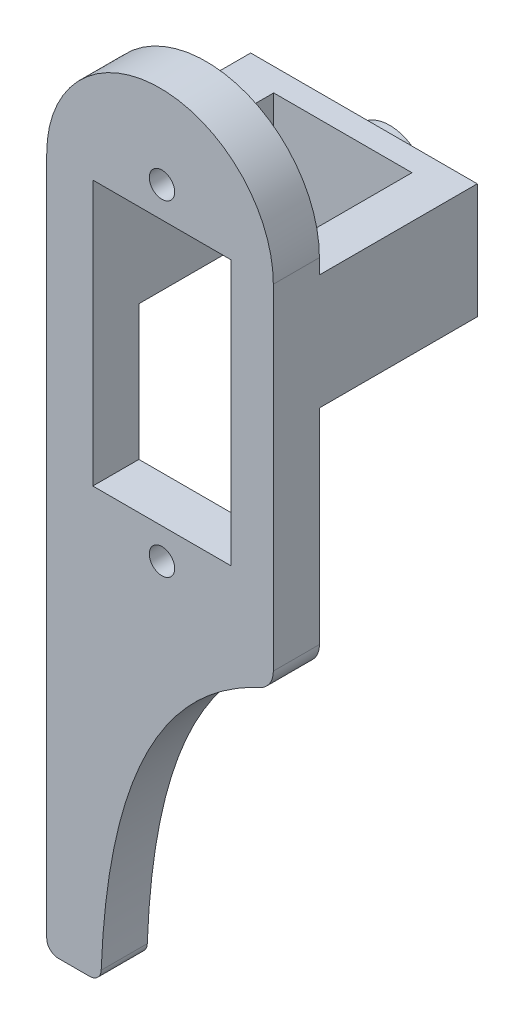
ISO-10303-21;
HEADER;
FILE_DESCRIPTION(('STEP AP214'),'2;1');
FILE_NAME('part.step','',(''),(''),'','','');
FILE_SCHEMA(('AUTOMOTIVE_DESIGN { 1 0 10303 214 1 1 1 1 }'));
ENDSEC;
DATA;
#1=APPLICATION_CONTEXT('core data for automotive mechanical design processes');
#2=APPLICATION_PROTOCOL_DEFINITION('international standard','automotive_design',2000,#1);
#3=PRODUCT_CONTEXT('',#1,'mechanical');
#4=PRODUCT('Part','Part','',(#3));
#5=PRODUCT_RELATED_PRODUCT_CATEGORY('part','',(#4));
#6=PRODUCT_DEFINITION_FORMATION('','',#4);
#7=PRODUCT_DEFINITION_CONTEXT('part definition',#1,'design');
#8=PRODUCT_DEFINITION('design','',#6,#7);
#9=PRODUCT_DEFINITION_SHAPE('','',#8);
#10=(LENGTH_UNIT() NAMED_UNIT(*) SI_UNIT(.MILLI.,.METRE.));
#11=(NAMED_UNIT(*) PLANE_ANGLE_UNIT() SI_UNIT($,.RADIAN.));
#12=(NAMED_UNIT(*) SI_UNIT($,.STERADIAN.) SOLID_ANGLE_UNIT());
#13=UNCERTAINTY_MEASURE_WITH_UNIT(LENGTH_MEASURE(1.E-05),#10,'distance_accuracy_value','');
#14=(GEOMETRIC_REPRESENTATION_CONTEXT(3) GLOBAL_UNCERTAINTY_ASSIGNED_CONTEXT((#13)) GLOBAL_UNIT_ASSIGNED_CONTEXT((#10,
#11,#12)) REPRESENTATION_CONTEXT('',''));
#15=CARTESIAN_POINT('',(0.,0.,0.));
#16=DIRECTION('',(0.,0.,1.));
#17=DIRECTION('',(1.,0.,0.));
#18=AXIS2_PLACEMENT_3D('',#15,#16,#17);
#19=CARTESIAN_POINT('',(20.0527361312337,1.43470935286026,0.));
#20=DIRECTION('',(0.,0.,-1.));
#21=DIRECTION('',(-1.,0.,0.));
#22=AXIS2_PLACEMENT_3D('',#19,#20,#21);
#23=PLANE('',#22);
#24=CARTESIAN_POINT('',(20.2195760836481,-24.2152906471397,0.));
#25=DIRECTION('',(0.,0.,-1.));
#26=DIRECTION('',(-1.,0.,0.));
#27=AXIS2_PLACEMENT_3D('',#24,#25,#26);
#28=CIRCLE('',#27,1.1);
#29=CARTESIAN_POINT('',(19.1195760836481,-24.2152906471397,0.));
#30=VERTEX_POINT('',#29);
#31=EDGE_CURVE('E193',#30,#30,#28,.F.);
#32=ORIENTED_EDGE('',*,*,#31,.T.);
#33=EDGE_LOOP('',(#32));
#34=FACE_BOUND('',#33,.T.);
#35=DIRECTION('',(0.,-1.,0.));
#36=VECTOR('',#35,1.);
#37=CARTESIAN_POINT('',(10.2195760836481,1.43470935286026,0.));
#38=LINE('',#37,#36);
#39=CARTESIAN_POINT('',(10.2195760836481,-9.86529064713974,0.));
#40=VERTEX_POINT('',#39);
#41=CARTESIAN_POINT('',(10.2195760836481,-57.5652906471397,0.));
#42=VERTEX_POINT('',#41);
#43=EDGE_CURVE('E56',#40,#42,#38,.T.);
#44=ORIENTED_EDGE('',*,*,#43,.F.);
#45=DIRECTION('',(-1.,0.,0.));
#46=VECTOR('',#45,1.);
#47=CARTESIAN_POINT('',(14.2195760836481,-9.86529064713974,0.));
#48=LINE('',#47,#46);
#49=CARTESIAN_POINT('',(14.2195760836481,-9.86529064713974,0.));
#50=VERTEX_POINT('',#49);
#51=EDGE_CURVE('E224',#50,#40,#48,.T.);
#52=ORIENTED_EDGE('',*,*,#51,.F.);
#53=DIRECTION('',(0.,-1.,0.));
#54=VECTOR('',#53,1.);
#55=CARTESIAN_POINT('',(14.2195760836481,1.43470935286026,0.));
#56=LINE('',#55,#54);
#57=CARTESIAN_POINT('',(14.2195760836481,-21.5652906471397,0.));
#58=VERTEX_POINT('',#57);
#59=EDGE_CURVE('E295',#50,#58,#56,.T.);
#60=ORIENTED_EDGE('',*,*,#59,.T.);
#61=DIRECTION('',(1.,0.,0.));
#62=VECTOR('',#61,1.);
#63=CARTESIAN_POINT('',(14.2195760836481,-21.5652906471397,0.));
#64=LINE('',#63,#62);
#65=CARTESIAN_POINT('',(26.2195760836481,-21.5652906471397,0.));
#66=VERTEX_POINT('',#65);
#67=EDGE_CURVE('E318',#58,#66,#64,.T.);
#68=ORIENTED_EDGE('',*,*,#67,.T.);
#69=DIRECTION('',(0.,1.,0.));
#70=VECTOR('',#69,1.);
#71=CARTESIAN_POINT('',(26.2195760836481,1.43470935286026,0.));
#72=LINE('',#71,#70);
#73=CARTESIAN_POINT('',(26.2195760836481,-9.86529064713974,0.));
#74=VERTEX_POINT('',#73);
#75=EDGE_CURVE('E288',#66,#74,#72,.T.);
#76=ORIENTED_EDGE('',*,*,#75,.T.);
#77=DIRECTION('',(-1.,0.,0.));
#78=VECTOR('',#77,1.);
#79=CARTESIAN_POINT('',(29.8858961788194,-9.86529064713974,0.));
#80=LINE('',#79,#78);
#81=CARTESIAN_POINT('',(29.8858961788194,-9.86529064713974,0.));
#82=VERTEX_POINT('',#81);
#83=EDGE_CURVE('E251',#82,#74,#80,.T.);
#84=ORIENTED_EDGE('',*,*,#83,.F.);
#85=DIRECTION('',(0.,1.,0.));
#86=VECTOR('',#85,1.);
#87=CARTESIAN_POINT('',(29.8858961788194,-28.969975988386,0.));
#88=LINE('',#87,#86);
#89=CARTESIAN_POINT('',(29.8858961788194,-27.6467575510426,0.));
#90=VERTEX_POINT('',#89);
#91=EDGE_CURVE('E189',#90,#82,#88,.T.);
#92=ORIENTED_EDGE('',*,*,#91,.F.);
#93=CARTESIAN_POINT('',(27.8858961788193,-27.6467575510426,0.));
#94=DIRECTION('',(0.,0.,-1.));
#95=DIRECTION('',(-1.,0.,0.));
#96=AXIS2_PLACEMENT_3D('',#93,#94,#95);
#97=CIRCLE('',#96,2.);
#98=CARTESIAN_POINT('',(28.7223689960516,-29.4634339740832,0.));
#99=VERTEX_POINT('',#98);
#100=EDGE_CURVE('E657',#90,#99,#97,.T.);
#101=ORIENTED_EDGE('',*,*,#100,.T.);
#102=CARTESIAN_POINT('',(14.9212994340402,-58.3072050953959,0.));
#103=CARTESIAN_POINT('',(15.603913992348,-34.5286239738719,0.));
#104=CARTESIAN_POINT('',(29.8858961788194,-28.969975988386,0.));
#105=B_SPLINE_CURVE_WITH_KNOTS('',2,(#102,#103,#104),.UNSPECIFIED.,.F.,.F.,(3,3),(0.,1.),.UNSPECIFIED.);
#106=CARTESIAN_POINT('',(14.9446503491445,-57.6029191019327,0.));
#107=VERTEX_POINT('',#106);
#108=EDGE_CURVE('E627',#107,#99,#105,.T.);
#109=ORIENTED_EDGE('',*,*,#108,.F.);
#110=CARTESIAN_POINT('',(13.9453585502239,-57.5652906471397,0.));
#111=DIRECTION('',(0.,0.,-1.));
#112=DIRECTION('',(-1.,0.,0.));
#113=AXIS2_PLACEMENT_3D('',#110,#111,#112);
#114=CIRCLE('',#113,1.);
#115=CARTESIAN_POINT('',(13.9453585502239,-58.5652906471397,0.));
#116=VERTEX_POINT('',#115);
#117=EDGE_CURVE('E672',#107,#116,#114,.T.);
#118=ORIENTED_EDGE('',*,*,#117,.T.);
#119=DIRECTION('',(1.,0.,0.));
#120=VECTOR('',#119,1.);
#121=CARTESIAN_POINT('',(10.2195760836481,-58.5652906471397,0.));
#122=LINE('',#121,#120);
#123=CARTESIAN_POINT('',(11.2195760836481,-58.5652906471397,0.));
#124=VERTEX_POINT('',#123);
#125=EDGE_CURVE('E641',#124,#116,#122,.T.);
#126=ORIENTED_EDGE('',*,*,#125,.F.);
#127=CARTESIAN_POINT('',(11.2195760836481,-57.5652906471397,0.));
#128=DIRECTION('',(0.,0.,-1.));
#129=DIRECTION('',(-1.,0.,0.));
#130=AXIS2_PLACEMENT_3D('',#127,#128,#129);
#131=CIRCLE('',#130,1.);
#132=EDGE_CURVE('E687',#124,#42,#131,.T.);
#133=ORIENTED_EDGE('',*,*,#132,.T.);
#134=EDGE_LOOP('',(#44,#52,#60,#68,#76,#84,#92,#101,#109,#118,#126,#133));
#135=FACE_BOUND('',#134,.T.);
#136=ADVANCED_FACE('F39',(#34,#135),#23,.T.);
#137=CARTESIAN_POINT('',(20.2195760836481,4.08470935286026,0.));
#138=DIRECTION('',(0.,0.,-1.));
#139=DIRECTION('',(-1.,0.,0.));
#140=AXIS2_PLACEMENT_3D('',#137,#138,#139);
#141=CIRCLE('',#140,1.1);
#142=CARTESIAN_POINT('',(19.1195760836481,4.08470935286026,0.));
#143=VERTEX_POINT('',#142);
#144=EDGE_CURVE('E277',#143,#143,#141,.F.);
#145=ORIENTED_EDGE('',*,*,#144,.T.);
#146=EDGE_LOOP('',(#145));
#147=FACE_BOUND('',#146,.T.);
#148=CARTESIAN_POINT('',(14.2195760836481,1.43470935286026,0.));
#149=VERTEX_POINT('',#148);
#150=CARTESIAN_POINT('',(14.2195760836481,0.134709352860258,0.));
#151=VERTEX_POINT('',#150);
#152=EDGE_CURVE('E296',#149,#151,#56,.T.);
#153=ORIENTED_EDGE('',*,*,#152,.T.);
#154=DIRECTION('',(1.,0.,0.));
#155=VECTOR('',#154,1.);
#156=CARTESIAN_POINT('',(14.2195760836481,0.134709352860258,0.));
#157=LINE('',#156,#155);
#158=CARTESIAN_POINT('',(10.2195760836481,0.134709352860258,0.));
#159=VERTEX_POINT('',#158);
#160=EDGE_CURVE('E64',#159,#151,#157,.T.);
#161=ORIENTED_EDGE('',*,*,#160,.F.);
#162=CARTESIAN_POINT('',(10.2195760836481,1.43470935286026,0.));
#163=VERTEX_POINT('',#162);
#164=EDGE_CURVE('E634',#163,#159,#38,.T.);
#165=ORIENTED_EDGE('',*,*,#164,.F.);
#166=CARTESIAN_POINT('',(20.0527361312337,1.43470935286026,0.));
#167=DIRECTION('',(0.,0.,1.));
#168=DIRECTION('',(-1.,0.,0.));
#169=AXIS2_PLACEMENT_3D('',#166,#167,#168);
#170=CIRCLE('',#169,9.83316004758562);
#171=CARTESIAN_POINT('',(29.8858961788194,1.43470935286026,0.));
#172=VERTEX_POINT('',#171);
#173=EDGE_CURVE('E331',#172,#163,#170,.T.);
#174=ORIENTED_EDGE('',*,*,#173,.F.);
#175=CARTESIAN_POINT('',(29.8858961788194,0.134709352860259,0.));
#176=VERTEX_POINT('',#175);
#177=EDGE_CURVE('E621',#176,#172,#88,.T.);
#178=ORIENTED_EDGE('',*,*,#177,.F.);
#179=DIRECTION('',(1.,0.,0.));
#180=VECTOR('',#179,1.);
#181=CARTESIAN_POINT('',(29.8858961788194,0.134709352860259,0.));
#182=LINE('',#181,#180);
#183=CARTESIAN_POINT('',(26.2195760836481,0.134709352860258,0.));
#184=VERTEX_POINT('',#183);
#185=EDGE_CURVE('E257',#184,#176,#182,.T.);
#186=ORIENTED_EDGE('',*,*,#185,.F.);
#187=CARTESIAN_POINT('',(26.2195760836481,1.43470935286026,0.));
#188=VERTEX_POINT('',#187);
#189=EDGE_CURVE('E276',#184,#188,#72,.T.);
#190=ORIENTED_EDGE('',*,*,#189,.T.);
#191=DIRECTION('',(-1.,0.,0.));
#192=VECTOR('',#191,1.);
#193=CARTESIAN_POINT('',(14.2195760836481,1.43470935286026,0.));
#194=LINE('',#193,#192);
#195=EDGE_CURVE('E291',#188,#149,#194,.T.);
#196=ORIENTED_EDGE('',*,*,#195,.T.);
#197=EDGE_LOOP('',(#153,#161,#165,#174,#178,#186,#190,#196));
#198=FACE_BOUND('',#197,.T.);
#199=ADVANCED_FACE('F372',(#147,#198),#23,.T.);
#200=CARTESIAN_POINT('',(20.0527361312337,1.43470935286026,4.));
#201=DIRECTION('',(0.,0.,-1.));
#202=DIRECTION('',(-1.,0.,0.));
#203=AXIS2_PLACEMENT_3D('',#200,#201,#202);
#204=CYLINDRICAL_SURFACE('',#203,9.83316004758562);
#205=ORIENTED_EDGE('',*,*,#173,.T.);
#206=DIRECTION('',(0.,0.,-1.));
#207=VECTOR('',#206,1.);
#208=CARTESIAN_POINT('',(10.2195760836481,1.43470935286026,4.));
#209=LINE('',#208,#207);
#210=CARTESIAN_POINT('',(10.2195760836481,1.43470935286026,4.));
#211=VERTEX_POINT('',#210);
#212=EDGE_CURVE('E632',#211,#163,#209,.T.);
#213=ORIENTED_EDGE('',*,*,#212,.F.);
#214=CARTESIAN_POINT('',(20.0527361312337,1.43470935286026,4.));
#215=DIRECTION('',(0.,0.,1.));
#216=DIRECTION('',(-1.,0.,0.));
#217=AXIS2_PLACEMENT_3D('',#214,#215,#216);
#218=CIRCLE('',#217,9.83316004758562);
#219=CARTESIAN_POINT('',(29.8858961788194,1.43470935286026,4.));
#220=VERTEX_POINT('',#219);
#221=EDGE_CURVE('E332',#220,#211,#218,.T.);
#222=ORIENTED_EDGE('',*,*,#221,.F.);
#223=DIRECTION('',(0.,0.,-1.));
#224=VECTOR('',#223,1.);
#225=CARTESIAN_POINT('',(29.8858961788194,1.43470935286026,4.));
#226=LINE('',#225,#224);
#227=EDGE_CURVE('E623',#220,#172,#226,.T.);
#228=ORIENTED_EDGE('',*,*,#227,.T.);
#229=EDGE_LOOP('',(#205,#213,#222,#228));
#230=FACE_BOUND('',#229,.T.);
#231=ADVANCED_FACE('F368',(#230),#204,.T.);
#232=CARTESIAN_POINT('',(10.2195760836481,1.43470935286026,4.));
#233=DIRECTION('',(1.,0.,0.));
#234=DIRECTION('',(0.,0.,-1.));
#235=AXIS2_PLACEMENT_3D('',#232,#233,#234);
#236=PLANE('',#235);
#237=ORIENTED_EDGE('',*,*,#164,.T.);
#238=DIRECTION('',(0.,0.,1.));
#239=VECTOR('',#238,1.);
#240=CARTESIAN_POINT('',(10.2195760836481,0.134709352860258,-11.7));
#241=LINE('',#240,#239);
#242=CARTESIAN_POINT('',(10.2195760836481,0.134709352860259,-13.7));
#243=VERTEX_POINT('',#242);
#244=EDGE_CURVE('E241',#243,#159,#241,.T.);
#245=ORIENTED_EDGE('',*,*,#244,.F.);
#246=DIRECTION('',(0.,1.,0.));
#247=VECTOR('',#246,1.);
#248=CARTESIAN_POINT('',(10.2195760836481,0.134709352860259,-13.7));
#249=LINE('',#248,#247);
#250=CARTESIAN_POINT('',(10.2195760836481,-9.86529064713974,-13.7));
#251=VERTEX_POINT('',#250);
#252=EDGE_CURVE('E205',#251,#243,#249,.T.);
#253=ORIENTED_EDGE('',*,*,#252,.F.);
#254=DIRECTION('',(0.,0.,1.));
#255=VECTOR('',#254,1.);
#256=CARTESIAN_POINT('',(10.2195760836481,-9.86529064713974,-11.7));
#257=LINE('',#256,#255);
#258=EDGE_CURVE('E200',#251,#40,#257,.T.);
#259=ORIENTED_EDGE('',*,*,#258,.T.);
#260=ORIENTED_EDGE('',*,*,#43,.T.);
#261=DIRECTION('',(0.,0.,-1.));
#262=VECTOR('',#261,1.);
#263=CARTESIAN_POINT('',(10.2195760836481,-57.5652906471397,4.));
#264=LINE('',#263,#262);
#265=CARTESIAN_POINT('',(10.2195760836481,-57.5652906471397,4.));
#266=VERTEX_POINT('',#265);
#267=EDGE_CURVE('E689',#42,#266,#264,.F.);
#268=ORIENTED_EDGE('',*,*,#267,.T.);
#269=DIRECTION('',(0.,-1.,0.));
#270=VECTOR('',#269,1.);
#271=CARTESIAN_POINT('',(10.2195760836481,1.43470935286026,4.));
#272=LINE('',#271,#270);
#273=EDGE_CURVE('E336',#211,#266,#272,.T.);
#274=ORIENTED_EDGE('',*,*,#273,.F.);
#275=ORIENTED_EDGE('',*,*,#212,.T.);
#276=EDGE_LOOP('',(#237,#245,#253,#259,#260,#268,#274,#275));
#277=FACE_BOUND('',#276,.T.);
#278=ADVANCED_FACE('F364',(#277),#236,.F.);
#279=CARTESIAN_POINT('',(10.2195760836481,-58.5652906471397,4.));
#280=DIRECTION('',(0.,1.,0.));
#281=DIRECTION('',(0.,0.,1.));
#282=AXIS2_PLACEMENT_3D('',#279,#280,#281);
#283=PLANE('',#282);
#284=DIRECTION('',(1.,0.,0.));
#285=VECTOR('',#284,1.);
#286=CARTESIAN_POINT('',(10.2195760836481,-58.5652906471397,4.));
#287=LINE('',#286,#285);
#288=CARTESIAN_POINT('',(11.2195760836481,-58.5652906471397,4.));
#289=VERTEX_POINT('',#288);
#290=CARTESIAN_POINT('',(13.9453585502239,-58.5652906471397,4.));
#291=VERTEX_POINT('',#290);
#292=EDGE_CURVE('E340',#289,#291,#287,.T.);
#293=ORIENTED_EDGE('',*,*,#292,.F.);
#294=DIRECTION('',(0.,0.,-1.));
#295=VECTOR('',#294,1.);
#296=CARTESIAN_POINT('',(11.2195760836481,-58.5652906471397,4.));
#297=LINE('',#296,#295);
#298=EDGE_CURVE('E683',#289,#124,#297,.T.);
#299=ORIENTED_EDGE('',*,*,#298,.T.);
#300=ORIENTED_EDGE('',*,*,#125,.T.);
#301=DIRECTION('',(0.,0.,-1.));
#302=VECTOR('',#301,1.);
#303=CARTESIAN_POINT('',(13.9453585502239,-58.5652906471397,4.));
#304=LINE('',#303,#302);
#305=EDGE_CURVE('E676',#116,#291,#304,.F.);
#306=ORIENTED_EDGE('',*,*,#305,.T.);
#307=EDGE_LOOP('',(#293,#299,#300,#306));
#308=FACE_BOUND('',#307,.T.);
#309=ADVANCED_FACE('F359',(#308),#283,.F.);
#310=CARTESIAN_POINT('',(14.9212994340402,-58.3072050953959,4.));
#311=CARTESIAN_POINT('',(15.603913992348,-34.5286239738719,4.));
#312=CARTESIAN_POINT('',(29.8858961788194,-28.969975988386,4.));
#313=B_SPLINE_CURVE_WITH_KNOTS('',2,(#310,#311,#312),.UNSPECIFIED.,.F.,.F.,(3,3),(0.,1.),.UNSPECIFIED.);
#314=DIRECTION('',(0.,0.,-1.));
#315=VECTOR('',#314,1.);
#316=SURFACE_OF_LINEAR_EXTRUSION('',#313,#315);
#317=CARTESIAN_POINT('',(14.9446503491445,-57.6029191019327,4.));
#318=VERTEX_POINT('',#317);
#319=CARTESIAN_POINT('',(28.7223689960516,-29.4634339740832,4.));
#320=VERTEX_POINT('',#319);
#321=EDGE_CURVE('E343',#318,#320,#313,.T.);
#322=ORIENTED_EDGE('',*,*,#321,.F.);
#323=DIRECTION('',(0.,0.,-1.));
#324=VECTOR('',#323,1.);
#325=CARTESIAN_POINT('',(14.9446503491445,-57.6029191019324,4.));
#326=LINE('',#325,#324);
#327=EDGE_CURVE('E668',#318,#107,#326,.T.);
#328=ORIENTED_EDGE('',*,*,#327,.T.);
#329=ORIENTED_EDGE('',*,*,#108,.T.);
#330=DIRECTION('',(0.,0.,-1.));
#331=VECTOR('',#330,1.);
#332=CARTESIAN_POINT('',(28.7223689960495,-29.4634339740842,0.));
#333=LINE('',#332,#331);
#334=EDGE_CURVE('E661',#99,#320,#333,.F.);
#335=ORIENTED_EDGE('',*,*,#334,.T.);
#336=EDGE_LOOP('',(#322,#328,#329,#335));
#337=FACE_BOUND('',#336,.T.);
#338=ADVANCED_FACE('F355',(#337),#316,.F.);
#339=CARTESIAN_POINT('',(29.8858961788194,-28.969975988386,4.));
#340=DIRECTION('',(-1.,0.,0.));
#341=DIRECTION('',(0.,0.,1.));
#342=AXIS2_PLACEMENT_3D('',#339,#340,#341);
#343=PLANE('',#342);
#344=DIRECTION('',(0.,1.,0.));
#345=VECTOR('',#344,1.);
#346=CARTESIAN_POINT('',(29.8858961788194,-28.969975988386,4.));
#347=LINE('',#346,#345);
#348=CARTESIAN_POINT('',(29.8858961788194,-27.6467575510426,4.));
#349=VERTEX_POINT('',#348);
#350=EDGE_CURVE('E349',#349,#220,#347,.T.);
#351=ORIENTED_EDGE('',*,*,#350,.F.);
#352=DIRECTION('',(0.,0.,-1.));
#353=VECTOR('',#352,1.);
#354=CARTESIAN_POINT('',(29.8858961788194,-27.6467575510426,4.));
#355=LINE('',#354,#353);
#356=EDGE_CURVE('E654',#349,#90,#355,.T.);
#357=ORIENTED_EDGE('',*,*,#356,.T.);
#358=ORIENTED_EDGE('',*,*,#91,.T.);
#359=DIRECTION('',(0.,0.,1.));
#360=VECTOR('',#359,1.);
#361=CARTESIAN_POINT('',(29.8858961788194,-9.86529064713974,-11.7));
#362=LINE('',#361,#360);
#363=CARTESIAN_POINT('',(29.8858961788194,-9.86529064713974,-13.7));
#364=VERTEX_POINT('',#363);
#365=EDGE_CURVE('E180',#364,#82,#362,.T.);
#366=ORIENTED_EDGE('',*,*,#365,.F.);
#367=DIRECTION('',(0.,-1.,0.));
#368=VECTOR('',#367,1.);
#369=CARTESIAN_POINT('',(29.8858961788194,0.134709352860259,-13.7));
#370=LINE('',#369,#368);
#371=CARTESIAN_POINT('',(29.8858961788194,0.134709352860259,-13.7));
#372=VERTEX_POINT('',#371);
#373=EDGE_CURVE('E186',#372,#364,#370,.T.);
#374=ORIENTED_EDGE('',*,*,#373,.F.);
#375=DIRECTION('',(0.,0.,1.));
#376=VECTOR('',#375,1.);
#377=CARTESIAN_POINT('',(29.8858961788194,0.134709352860259,-11.7));
#378=LINE('',#377,#376);
#379=EDGE_CURVE('E256',#372,#176,#378,.T.);
#380=ORIENTED_EDGE('',*,*,#379,.T.);
#381=ORIENTED_EDGE('',*,*,#177,.T.);
#382=ORIENTED_EDGE('',*,*,#227,.F.);
#383=EDGE_LOOP('',(#351,#357,#358,#366,#374,#380,#381,#382));
#384=FACE_BOUND('',#383,.T.);
#385=ADVANCED_FACE('F183',(#384),#343,.F.);
#386=CARTESIAN_POINT('',(20.0527361312337,1.43470935286026,4.));
#387=DIRECTION('',(0.,0.,-1.));
#388=DIRECTION('',(-1.,0.,0.));
#389=AXIS2_PLACEMENT_3D('',#386,#387,#388);
#390=PLANE('',#389);
#391=CARTESIAN_POINT('',(20.2195760836481,-24.2152906471397,4.));
#392=DIRECTION('',(0.,0.,1.));
#393=DIRECTION('',(1.,0.,0.));
#394=AXIS2_PLACEMENT_3D('',#391,#392,#393);
#395=CIRCLE('',#394,1.1);
#396=CARTESIAN_POINT('',(21.3195760836481,-24.2152906471397,4.));
#397=VERTEX_POINT('',#396);
#398=EDGE_CURVE('E281',#397,#397,#395,.T.);
#399=ORIENTED_EDGE('',*,*,#398,.F.);
#400=EDGE_LOOP('',(#399));
#401=FACE_BOUND('',#400,.T.);
#402=CARTESIAN_POINT('',(20.2195760836481,4.08470935286026,4.));
#403=DIRECTION('',(0.,0.,1.));
#404=DIRECTION('',(1.,0.,0.));
#405=AXIS2_PLACEMENT_3D('',#402,#403,#404);
#406=CIRCLE('',#405,1.1);
#407=CARTESIAN_POINT('',(21.3195760836481,4.08470935286026,4.));
#408=VERTEX_POINT('',#407);
#409=EDGE_CURVE('E272',#408,#408,#406,.T.);
#410=ORIENTED_EDGE('',*,*,#409,.F.);
#411=EDGE_LOOP('',(#410));
#412=FACE_BOUND('',#411,.T.);
#413=DIRECTION('',(1.,0.,0.));
#414=VECTOR('',#413,1.);
#415=CARTESIAN_POINT('',(14.2195760836481,-21.5652906471397,4.));
#416=LINE('',#415,#414);
#417=CARTESIAN_POINT('',(14.2195760836481,-21.5652906471397,4.));
#418=VERTEX_POINT('',#417);
#419=CARTESIAN_POINT('',(26.2195760836481,-21.5652906471397,4.));
#420=VERTEX_POINT('',#419);
#421=EDGE_CURVE('E302',#418,#420,#416,.T.);
#422=ORIENTED_EDGE('',*,*,#421,.F.);
#423=DIRECTION('',(0.,-1.,0.));
#424=VECTOR('',#423,1.);
#425=CARTESIAN_POINT('',(14.2195760836481,1.43470935286026,4.));
#426=LINE('',#425,#424);
#427=CARTESIAN_POINT('',(14.2195760836481,1.43470935286026,4.));
#428=VERTEX_POINT('',#427);
#429=EDGE_CURVE('E299',#428,#418,#426,.T.);
#430=ORIENTED_EDGE('',*,*,#429,.F.);
#431=DIRECTION('',(-1.,0.,0.));
#432=VECTOR('',#431,1.);
#433=CARTESIAN_POINT('',(14.2195760836481,1.43470935286026,4.));
#434=LINE('',#433,#432);
#435=CARTESIAN_POINT('',(26.2195760836481,1.43470935286026,4.));
#436=VERTEX_POINT('',#435);
#437=EDGE_CURVE('E310',#436,#428,#434,.T.);
#438=ORIENTED_EDGE('',*,*,#437,.F.);
#439=DIRECTION('',(0.,1.,0.));
#440=VECTOR('',#439,1.);
#441=CARTESIAN_POINT('',(26.2195760836481,1.43470935286026,4.));
#442=LINE('',#441,#440);
#443=EDGE_CURVE('E306',#420,#436,#442,.T.);
#444=ORIENTED_EDGE('',*,*,#443,.F.);
#445=EDGE_LOOP('',(#422,#430,#438,#444));
#446=FACE_BOUND('',#445,.T.);
#447=ORIENTED_EDGE('',*,*,#273,.T.);
#448=CARTESIAN_POINT('',(11.2195760836481,-57.5652906471397,4.));
#449=DIRECTION('',(0.,0.,-1.));
#450=DIRECTION('',(-1.,0.,0.));
#451=AXIS2_PLACEMENT_3D('',#448,#449,#450);
#452=CIRCLE('',#451,1.);
#453=EDGE_CURVE('E43',#266,#289,#452,.F.);
#454=ORIENTED_EDGE('',*,*,#453,.T.);
#455=ORIENTED_EDGE('',*,*,#292,.T.);
#456=CARTESIAN_POINT('',(13.9453585502239,-57.5652906471397,4.));
#457=DIRECTION('',(0.,0.,-1.));
#458=DIRECTION('',(-1.,0.,0.));
#459=AXIS2_PLACEMENT_3D('',#456,#457,#458);
#460=CIRCLE('',#459,1.);
#461=EDGE_CURVE('E680',#291,#318,#460,.F.);
#462=ORIENTED_EDGE('',*,*,#461,.T.);
#463=ORIENTED_EDGE('',*,*,#321,.T.);
#464=CARTESIAN_POINT('',(27.8858961788193,-27.6467575510426,4.));
#465=DIRECTION('',(0.,0.,-1.));
#466=DIRECTION('',(-1.,0.,0.));
#467=AXIS2_PLACEMENT_3D('',#464,#465,#466);
#468=CIRCLE('',#467,2.);
#469=EDGE_CURVE('E665',#320,#349,#468,.F.);
#470=ORIENTED_EDGE('',*,*,#469,.T.);
#471=ORIENTED_EDGE('',*,*,#350,.T.);
#472=ORIENTED_EDGE('',*,*,#221,.T.);
#473=EDGE_LOOP('',(#447,#454,#455,#462,#463,#470,#471,#472));
#474=FACE_BOUND('',#473,.T.);
#475=ADVANCED_FACE('F393',(#401,#412,#446,#474),#390,.F.);
#476=CARTESIAN_POINT('',(14.2195760836481,1.43470935286026,-0.00100000000000013));
#477=DIRECTION('',(-1.,0.,0.));
#478=DIRECTION('',(0.,-1.,0.));
#479=AXIS2_PLACEMENT_3D('',#476,#477,#478);
#480=PLANE('',#479);
#481=DIRECTION('',(0.,0.,1.));
#482=VECTOR('',#481,1.);
#483=CARTESIAN_POINT('',(14.2195760836481,1.43470935286026,-0.00100000000000013));
#484=LINE('',#483,#482);
#485=EDGE_CURVE('E315',#149,#428,#484,.T.);
#486=ORIENTED_EDGE('',*,*,#485,.T.);
#487=ORIENTED_EDGE('',*,*,#429,.T.);
#488=DIRECTION('',(0.,0.,1.));
#489=VECTOR('',#488,1.);
#490=CARTESIAN_POINT('',(14.2195760836481,-21.5652906471397,-0.00100000000000013));
#491=LINE('',#490,#489);
#492=EDGE_CURVE('E314',#58,#418,#491,.T.);
#493=ORIENTED_EDGE('',*,*,#492,.F.);
#494=ORIENTED_EDGE('',*,*,#59,.F.);
#495=DIRECTION('',(0.,0.,1.));
#496=VECTOR('',#495,1.);
#497=CARTESIAN_POINT('',(14.2195760836481,-9.86529064713974,-11.7));
#498=LINE('',#497,#496);
#499=CARTESIAN_POINT('',(14.2195760836481,-9.86529064713974,-11.7));
#500=VERTEX_POINT('',#499);
#501=EDGE_CURVE('E247',#500,#50,#498,.T.);
#502=ORIENTED_EDGE('',*,*,#501,.F.);
#503=DIRECTION('',(0.,-1.,0.));
#504=VECTOR('',#503,1.);
#505=CARTESIAN_POINT('',(14.2195760836481,0.134709352860258,-11.7));
#506=LINE('',#505,#504);
#507=CARTESIAN_POINT('',(14.2195760836481,0.134709352860258,-11.7));
#508=VERTEX_POINT('',#507);
#509=EDGE_CURVE('E229',#508,#500,#506,.T.);
#510=ORIENTED_EDGE('',*,*,#509,.F.);
#511=DIRECTION('',(0.,0.,1.));
#512=VECTOR('',#511,1.);
#513=CARTESIAN_POINT('',(14.2195760836481,0.134709352860258,-11.7));
#514=LINE('',#513,#512);
#515=EDGE_CURVE('E233',#508,#151,#514,.T.);
#516=ORIENTED_EDGE('',*,*,#515,.T.);
#517=ORIENTED_EDGE('',*,*,#152,.F.);
#518=EDGE_LOOP('',(#486,#487,#493,#494,#502,#510,#516,#517));
#519=FACE_BOUND('',#518,.T.);
#520=ADVANCED_FACE('F396',(#519),#480,.F.);
#521=CARTESIAN_POINT('',(14.2195760836481,1.43470935286026,-0.00100000000000013));
#522=DIRECTION('',(0.,1.,0.));
#523=DIRECTION('',(-1.,0.,0.));
#524=AXIS2_PLACEMENT_3D('',#521,#522,#523);
#525=PLANE('',#524);
#526=DIRECTION('',(0.,0.,1.));
#527=VECTOR('',#526,1.);
#528=CARTESIAN_POINT('',(26.2195760836481,1.43470935286026,-0.00100000000000013));
#529=LINE('',#528,#527);
#530=EDGE_CURVE('E319',#188,#436,#529,.T.);
#531=ORIENTED_EDGE('',*,*,#530,.T.);
#532=ORIENTED_EDGE('',*,*,#437,.T.);
#533=ORIENTED_EDGE('',*,*,#485,.F.);
#534=ORIENTED_EDGE('',*,*,#195,.F.);
#535=EDGE_LOOP('',(#531,#532,#533,#534));
#536=FACE_BOUND('',#535,.T.);
#537=ADVANCED_FACE('F400',(#536),#525,.F.);
#538=CARTESIAN_POINT('',(26.2195760836481,1.43470935286026,-0.00100000000000013));
#539=DIRECTION('',(1.,0.,0.));
#540=DIRECTION('',(0.,1.,0.));
#541=AXIS2_PLACEMENT_3D('',#538,#539,#540);
#542=PLANE('',#541);
#543=DIRECTION('',(0.,0.,1.));
#544=VECTOR('',#543,1.);
#545=CARTESIAN_POINT('',(26.2195760836481,-21.5652906471397,-0.00100000000000013));
#546=LINE('',#545,#544);
#547=EDGE_CURVE('E322',#66,#420,#546,.T.);
#548=ORIENTED_EDGE('',*,*,#547,.T.);
#549=ORIENTED_EDGE('',*,*,#443,.T.);
#550=ORIENTED_EDGE('',*,*,#530,.F.);
#551=ORIENTED_EDGE('',*,*,#189,.F.);
#552=DIRECTION('',(0.,0.,1.));
#553=VECTOR('',#552,1.);
#554=CARTESIAN_POINT('',(26.2195760836481,0.134709352860258,-11.7));
#555=LINE('',#554,#553);
#556=CARTESIAN_POINT('',(26.2195760836481,0.134709352860259,-11.7));
#557=VERTEX_POINT('',#556);
#558=EDGE_CURVE('E265',#557,#184,#555,.T.);
#559=ORIENTED_EDGE('',*,*,#558,.F.);
#560=DIRECTION('',(0.,1.,0.));
#561=VECTOR('',#560,1.);
#562=CARTESIAN_POINT('',(26.2195760836481,0.134709352860258,-11.7));
#563=LINE('',#562,#561);
#564=CARTESIAN_POINT('',(26.2195760836481,-9.86529064713974,-11.7));
#565=VERTEX_POINT('',#564);
#566=EDGE_CURVE('E252',#565,#557,#563,.T.);
#567=ORIENTED_EDGE('',*,*,#566,.F.);
#568=DIRECTION('',(0.,0.,1.));
#569=VECTOR('',#568,1.);
#570=CARTESIAN_POINT('',(26.2195760836481,-9.86529064713974,-11.7));
#571=LINE('',#570,#569);
#572=EDGE_CURVE('E194',#565,#74,#571,.T.);
#573=ORIENTED_EDGE('',*,*,#572,.T.);
#574=ORIENTED_EDGE('',*,*,#75,.F.);
#575=EDGE_LOOP('',(#548,#549,#550,#551,#559,#567,#573,#574));
#576=FACE_BOUND('',#575,.T.);
#577=ADVANCED_FACE('F406',(#576),#542,.F.);
#578=CARTESIAN_POINT('',(14.2195760836481,-21.5652906471397,-0.00100000000000013));
#579=DIRECTION('',(0.,-1.,0.));
#580=DIRECTION('',(0.,0.,-1.));
#581=AXIS2_PLACEMENT_3D('',#578,#579,#580);
#582=PLANE('',#581);
#583=ORIENTED_EDGE('',*,*,#492,.T.);
#584=ORIENTED_EDGE('',*,*,#421,.T.);
#585=ORIENTED_EDGE('',*,*,#547,.F.);
#586=ORIENTED_EDGE('',*,*,#67,.F.);
#587=EDGE_LOOP('',(#583,#584,#585,#586));
#588=FACE_BOUND('',#587,.T.);
#589=ADVANCED_FACE('F402',(#588),#582,.F.);
#590=CARTESIAN_POINT('',(20.2195760836481,4.08470935286026,-0.00100000000000013));
#591=DIRECTION('',(0.,0.,1.));
#592=DIRECTION('',(1.,0.,0.));
#593=AXIS2_PLACEMENT_3D('',#590,#591,#592);
#594=CYLINDRICAL_SURFACE('',#593,1.1);
#595=ORIENTED_EDGE('',*,*,#144,.F.);
#596=EDGE_LOOP('',(#595));
#597=FACE_BOUND('',#596,.T.);
#598=ORIENTED_EDGE('',*,*,#409,.T.);
#599=EDGE_LOOP('',(#598));
#600=FACE_BOUND('',#599,.T.);
#601=ADVANCED_FACE('F405',(#597,#600),#594,.F.);
#602=CARTESIAN_POINT('',(20.2195760836481,-24.2152906471397,-0.00100000000000013));
#603=DIRECTION('',(0.,0.,1.));
#604=DIRECTION('',(1.,0.,0.));
#605=AXIS2_PLACEMENT_3D('',#602,#603,#604);
#606=CYLINDRICAL_SURFACE('',#605,1.1);
#607=ORIENTED_EDGE('',*,*,#31,.F.);
#608=EDGE_LOOP('',(#607));
#609=FACE_BOUND('',#608,.T.);
#610=ORIENTED_EDGE('',*,*,#398,.T.);
#611=EDGE_LOOP('',(#610));
#612=FACE_BOUND('',#611,.T.);
#613=ADVANCED_FACE('F377',(#609,#612),#606,.F.);
#614=CARTESIAN_POINT('',(27.8858961788193,-27.6467575510426,2.));
#615=DIRECTION('',(0.,0.,-1.));
#616=DIRECTION('',(-1.,0.,0.));
#617=AXIS2_PLACEMENT_3D('',#614,#615,#616);
#618=CYLINDRICAL_SURFACE('',#617,2.);
#619=ORIENTED_EDGE('',*,*,#469,.F.);
#620=ORIENTED_EDGE('',*,*,#334,.F.);
#621=ORIENTED_EDGE('',*,*,#100,.F.);
#622=ORIENTED_EDGE('',*,*,#356,.F.);
#623=EDGE_LOOP('',(#619,#620,#621,#622));
#624=FACE_BOUND('',#623,.T.);
#625=ADVANCED_FACE('F374',(#624),#618,.T.);
#626=CARTESIAN_POINT('',(13.9453585502239,-57.5652906471397,2.));
#627=DIRECTION('',(0.,0.,-1.));
#628=DIRECTION('',(-1.,0.,0.));
#629=AXIS2_PLACEMENT_3D('',#626,#627,#628);
#630=CYLINDRICAL_SURFACE('',#629,1.);
#631=ORIENTED_EDGE('',*,*,#461,.F.);
#632=ORIENTED_EDGE('',*,*,#305,.F.);
#633=ORIENTED_EDGE('',*,*,#117,.F.);
#634=ORIENTED_EDGE('',*,*,#327,.F.);
#635=EDGE_LOOP('',(#631,#632,#633,#634));
#636=FACE_BOUND('',#635,.T.);
#637=ADVANCED_FACE('F376',(#636),#630,.T.);
#638=CARTESIAN_POINT('',(11.2195760836481,-57.5652906471397,4.));
#639=DIRECTION('',(0.,0.,-1.));
#640=DIRECTION('',(-1.,0.,0.));
#641=AXIS2_PLACEMENT_3D('',#638,#639,#640);
#642=CYLINDRICAL_SURFACE('',#641,1.);
#643=ORIENTED_EDGE('',*,*,#453,.F.);
#644=ORIENTED_EDGE('',*,*,#267,.F.);
#645=ORIENTED_EDGE('',*,*,#132,.F.);
#646=ORIENTED_EDGE('',*,*,#298,.F.);
#647=EDGE_LOOP('',(#643,#644,#645,#646));
#648=FACE_BOUND('',#647,.T.);
#649=ADVANCED_FACE('F41',(#648),#642,.T.);
#650=CARTESIAN_POINT('',(29.8858961788194,-9.86529064713974,-11.7));
#651=DIRECTION('',(0.,1.,0.));
#652=DIRECTION('',(0.,0.,1.));
#653=AXIS2_PLACEMENT_3D('',#650,#651,#652);
#654=PLANE('',#653);
#655=ORIENTED_EDGE('',*,*,#83,.T.);
#656=ORIENTED_EDGE('',*,*,#572,.F.);
#657=DIRECTION('',(-1.,0.,0.));
#658=VECTOR('',#657,1.);
#659=CARTESIAN_POINT('',(29.8858961788194,-9.86529064713974,-11.7));
#660=LINE('',#659,#658);
#661=EDGE_CURVE('E216',#565,#500,#660,.T.);
#662=ORIENTED_EDGE('',*,*,#661,.T.);
#663=ORIENTED_EDGE('',*,*,#501,.T.);
#664=ORIENTED_EDGE('',*,*,#51,.T.);
#665=ORIENTED_EDGE('',*,*,#258,.F.);
#666=DIRECTION('',(-1.,0.,0.));
#667=VECTOR('',#666,1.);
#668=CARTESIAN_POINT('',(29.8858961788194,-9.86529064713974,-13.7));
#669=LINE('',#668,#667);
#670=EDGE_CURVE('E197',#364,#251,#669,.T.);
#671=ORIENTED_EDGE('',*,*,#670,.F.);
#672=ORIENTED_EDGE('',*,*,#365,.T.);
#673=EDGE_LOOP('',(#655,#656,#662,#663,#664,#665,#671,#672));
#674=FACE_BOUND('',#673,.T.);
#675=ADVANCED_FACE('F198',(#674),#654,.F.);
#676=CARTESIAN_POINT('',(29.8858961788194,0.134709352860259,-11.7));
#677=DIRECTION('',(0.,-1.,0.));
#678=DIRECTION('',(1.,0.,0.));
#679=AXIS2_PLACEMENT_3D('',#676,#677,#678);
#680=PLANE('',#679);
#681=ORIENTED_EDGE('',*,*,#185,.T.);
#682=ORIENTED_EDGE('',*,*,#379,.F.);
#683=DIRECTION('',(1.,0.,0.));
#684=VECTOR('',#683,1.);
#685=CARTESIAN_POINT('',(29.8858961788194,0.134709352860259,-13.7));
#686=LINE('',#685,#684);
#687=EDGE_CURVE('E210',#243,#372,#686,.T.);
#688=ORIENTED_EDGE('',*,*,#687,.F.);
#689=ORIENTED_EDGE('',*,*,#244,.T.);
#690=ORIENTED_EDGE('',*,*,#160,.T.);
#691=ORIENTED_EDGE('',*,*,#515,.F.);
#692=DIRECTION('',(1.,0.,0.));
#693=VECTOR('',#692,1.);
#694=CARTESIAN_POINT('',(29.8858961788194,0.134709352860259,-11.7));
#695=LINE('',#694,#693);
#696=EDGE_CURVE('E212',#508,#557,#695,.T.);
#697=ORIENTED_EDGE('',*,*,#696,.T.);
#698=ORIENTED_EDGE('',*,*,#558,.T.);
#699=EDGE_LOOP('',(#681,#682,#688,#689,#690,#691,#697,#698));
#700=FACE_BOUND('',#699,.T.);
#701=ADVANCED_FACE('F422',(#700),#680,.F.);
#702=CARTESIAN_POINT('',(0.,0.,-11.7));
#703=DIRECTION('',(0.,0.,-1.));
#704=DIRECTION('',(-1.,0.,0.));
#705=AXIS2_PLACEMENT_3D('',#702,#703,#704);
#706=PLANE('',#705);
#707=ORIENTED_EDGE('',*,*,#661,.F.);
#708=ORIENTED_EDGE('',*,*,#566,.T.);
#709=ORIENTED_EDGE('',*,*,#696,.F.);
#710=ORIENTED_EDGE('',*,*,#509,.T.);
#711=EDGE_LOOP('',(#707,#708,#709,#710));
#712=FACE_BOUND('',#711,.T.);
#713=ADVANCED_FACE('F425',(#712),#706,.F.);
#714=CARTESIAN_POINT('',(0.,0.,-13.7));
#715=DIRECTION('',(0.,0.,-1.));
#716=DIRECTION('',(-1.,0.,0.));
#717=AXIS2_PLACEMENT_3D('',#714,#715,#716);
#718=PLANE('',#717);
#719=CARTESIAN_POINT('',(20.2858961788194,-4.66529064713974,-13.7));
#720=DIRECTION('',(0.,0.,-1.));
#721=DIRECTION('',(-1.,0.,0.));
#722=AXIS2_PLACEMENT_3D('',#719,#720,#721);
#723=CIRCLE('',#722,3.4);
#724=CARTESIAN_POINT('',(16.8858961788194,-4.66529064713974,-13.7));
#725=VERTEX_POINT('',#724);
#726=EDGE_CURVE('E11',#725,#725,#723,.T.);
#727=ORIENTED_EDGE('',*,*,#726,.F.);
#728=EDGE_LOOP('',(#727));
#729=FACE_BOUND('',#728,.T.);
#730=ORIENTED_EDGE('',*,*,#373,.T.);
#731=ORIENTED_EDGE('',*,*,#670,.T.);
#732=ORIENTED_EDGE('',*,*,#252,.T.);
#733=ORIENTED_EDGE('',*,*,#687,.T.);
#734=EDGE_LOOP('',(#730,#731,#732,#733));
#735=FACE_BOUND('',#734,.T.);
#736=ADVANCED_FACE('F208',(#729,#735),#718,.T.);
#737=CARTESIAN_POINT('',(20.2858961788194,-4.66529064713974,-15.7));
#738=DIRECTION('',(0.,0.,1.));
#739=DIRECTION('',(1.,0.,0.));
#740=AXIS2_PLACEMENT_3D('',#737,#738,#739);
#741=CYLINDRICAL_SURFACE('',#740,3.4);
#742=CARTESIAN_POINT('',(20.2858961788194,-4.66529064713974,-15.7));
#743=DIRECTION('',(0.,0.,-1.));
#744=DIRECTION('',(-1.,0.,0.));
#745=AXIS2_PLACEMENT_3D('',#742,#743,#744);
#746=CIRCLE('',#745,3.4);
#747=CARTESIAN_POINT('',(16.8858961788194,-4.66529064713974,-15.7));
#748=VERTEX_POINT('',#747);
#749=EDGE_CURVE('E227',#748,#748,#746,.T.);
#750=ORIENTED_EDGE('',*,*,#749,.F.);
#751=EDGE_LOOP('',(#750));
#752=FACE_BOUND('',#751,.T.);
#753=ORIENTED_EDGE('',*,*,#726,.T.);
#754=EDGE_LOOP('',(#753));
#755=FACE_BOUND('',#754,.T.);
#756=ADVANCED_FACE('F432',(#752,#755),#741,.T.);
#757=CARTESIAN_POINT('',(20.2858961788194,-4.66529064713974,-15.7));
#758=DIRECTION('',(0.,0.,-1.));
#759=DIRECTION('',(-1.,0.,0.));
#760=AXIS2_PLACEMENT_3D('',#757,#758,#759);
#761=PLANE('',#760);
#762=ORIENTED_EDGE('',*,*,#749,.T.);
#763=EDGE_LOOP('',(#762));
#764=FACE_BOUND('',#763,.T.);
#765=ADVANCED_FACE('F436',(#764),#761,.T.);
#766=CLOSED_SHELL('',(#136,#199,#231,#278,#309,#338,#385,#475,#520,#537,#577,#589,#601,#613,
#625,#637,#649,#675,#701,#713,#736,#756,#765));
#767=MANIFOLD_SOLID_BREP('B2',#766);
#768=ADVANCED_BREP_SHAPE_REPRESENTATION('',(#18,#767),#14);
#769=SHAPE_DEFINITION_REPRESENTATION(#9,#768);
ENDSEC;
END-ISO-10303-21;
